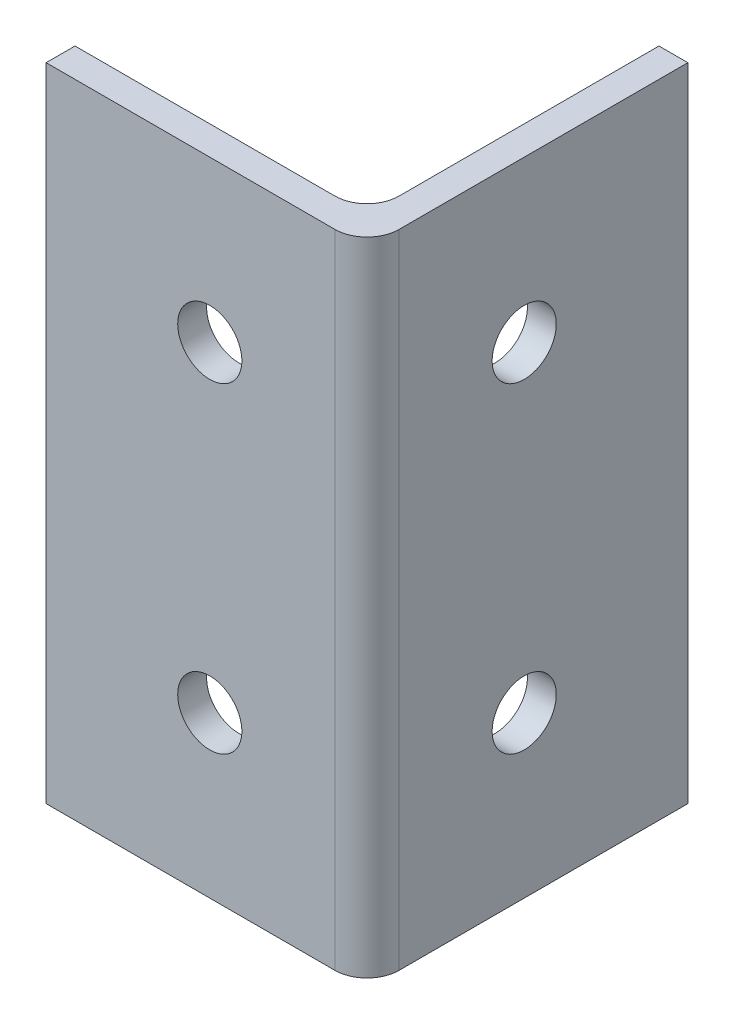
ISO-10303-21;
HEADER;
FILE_DESCRIPTION(('STEP AP214'),'2;1');
FILE_NAME('part.step','',(''),(''),'','','');
FILE_SCHEMA(('AUTOMOTIVE_DESIGN { 1 0 10303 214 1 1 1 1 }'));
ENDSEC;
DATA;
#1=APPLICATION_CONTEXT('core data for automotive mechanical design processes');
#2=APPLICATION_PROTOCOL_DEFINITION('international standard','automotive_design',2000,#1);
#3=PRODUCT_CONTEXT('',#1,'mechanical');
#4=PRODUCT('Part','Part','',(#3));
#5=PRODUCT_RELATED_PRODUCT_CATEGORY('part','',(#4));
#6=PRODUCT_DEFINITION_FORMATION('','',#4);
#7=PRODUCT_DEFINITION_CONTEXT('part definition',#1,'design');
#8=PRODUCT_DEFINITION('design','',#6,#7);
#9=PRODUCT_DEFINITION_SHAPE('','',#8);
#10=(LENGTH_UNIT() NAMED_UNIT(*) SI_UNIT(.MILLI.,.METRE.));
#11=(NAMED_UNIT(*) PLANE_ANGLE_UNIT() SI_UNIT($,.RADIAN.));
#12=(NAMED_UNIT(*) SI_UNIT($,.STERADIAN.) SOLID_ANGLE_UNIT());
#13=UNCERTAINTY_MEASURE_WITH_UNIT(LENGTH_MEASURE(1.E-05),#10,'distance_accuracy_value','');
#14=(GEOMETRIC_REPRESENTATION_CONTEXT(3) GLOBAL_UNCERTAINTY_ASSIGNED_CONTEXT((#13)) GLOBAL_UNIT_ASSIGNED_CONTEXT((#10,
#11,#12)) REPRESENTATION_CONTEXT('',''));
#15=CARTESIAN_POINT('',(0.,0.,0.));
#16=DIRECTION('',(0.,0.,1.));
#17=DIRECTION('',(1.,0.,0.));
#18=AXIS2_PLACEMENT_3D('',#15,#16,#17);
#19=CARTESIAN_POINT('',(-22.7091835511395,50.8,-14.2949948460226));
#20=DIRECTION('',(0.,0.,1.));
#21=DIRECTION('',(1.,0.,0.));
#22=AXIS2_PLACEMENT_3D('',#19,#20,#21);
#23=PLANE('',#22);
#24=DIRECTION('',(-1.,0.,0.));
#25=VECTOR('',#24,1.);
#26=CARTESIAN_POINT('',(-22.7091835511395,0.,-14.2949948460226));
#27=LINE('',#26,#25);
#28=CARTESIAN_POINT('',(-20.4231835511395,0.,-14.2949948460226));
#29=VERTEX_POINT('',#28);
#30=CARTESIAN_POINT('',(-22.7091835511395,0.,-14.2949948460226));
#31=VERTEX_POINT('',#30);
#32=EDGE_CURVE('E137',#29,#31,#27,.T.);
#33=ORIENTED_EDGE('',*,*,#32,.T.);
#34=DIRECTION('',(0.,-1.,0.));
#35=VECTOR('',#34,1.);
#36=CARTESIAN_POINT('',(-22.7091835511395,50.8,-14.2949948460226));
#37=LINE('',#36,#35);
#38=CARTESIAN_POINT('',(-22.7091835511395,50.8,-14.2949948460226));
#39=VERTEX_POINT('',#38);
#40=EDGE_CURVE('E116',#39,#31,#37,.T.);
#41=ORIENTED_EDGE('',*,*,#40,.F.);
#42=DIRECTION('',(-1.,0.,0.));
#43=VECTOR('',#42,1.);
#44=CARTESIAN_POINT('',(-22.7091835511395,50.8,-14.2949948460226));
#45=LINE('',#44,#43);
#46=CARTESIAN_POINT('',(-20.4231835511395,50.8,-14.2949948460226));
#47=VERTEX_POINT('',#46);
#48=EDGE_CURVE('E124',#47,#39,#45,.T.);
#49=ORIENTED_EDGE('',*,*,#48,.F.);
#50=DIRECTION('',(0.,-1.,0.));
#51=VECTOR('',#50,1.);
#52=CARTESIAN_POINT('',(-20.4231835511395,50.8,-14.2949948460226));
#53=LINE('',#52,#51);
#54=EDGE_CURVE('E210',#47,#29,#53,.T.);
#55=ORIENTED_EDGE('',*,*,#54,.T.);
#56=EDGE_LOOP('',(#33,#41,#49,#55));
#57=FACE_BOUND('',#56,.T.);
#58=ADVANCED_FACE('F43',(#57),#23,.F.);
#59=CARTESIAN_POINT('',(-22.7091835511395,50.8,-14.2949948460226));
#60=DIRECTION('',(1.,0.,0.));
#61=DIRECTION('',(0.,0.,-1.));
#62=AXIS2_PLACEMENT_3D('',#59,#60,#61);
#63=PLANE('',#62);
#64=CARTESIAN_POINT('',(-22.7091835511395,12.7,-1.34099484602264));
#65=DIRECTION('',(-1.,0.,0.));
#66=DIRECTION('',(0.,0.,1.));
#67=AXIS2_PLACEMENT_3D('',#64,#65,#66);
#68=CIRCLE('',#67,2.54);
#69=CARTESIAN_POINT('',(-22.7091835511395,12.7,1.19900515397736));
#70=VERTEX_POINT('',#69);
#71=EDGE_CURVE('E178',#70,#70,#68,.T.);
#72=ORIENTED_EDGE('',*,*,#71,.F.);
#73=EDGE_LOOP('',(#72));
#74=FACE_BOUND('',#73,.T.);
#75=CARTESIAN_POINT('',(-22.7091835511395,38.1,-1.34099484602272));
#76=DIRECTION('',(-1.,0.,0.));
#77=DIRECTION('',(0.,0.,1.));
#78=AXIS2_PLACEMENT_3D('',#75,#76,#77);
#79=CIRCLE('',#78,2.54);
#80=CARTESIAN_POINT('',(-22.7091835511395,38.1,1.19900515397728));
#81=VERTEX_POINT('',#80);
#82=EDGE_CURVE('E186',#81,#81,#79,.T.);
#83=ORIENTED_EDGE('',*,*,#82,.F.);
#84=EDGE_LOOP('',(#83));
#85=FACE_BOUND('',#84,.T.);
#86=DIRECTION('',(0.,0.,1.));
#87=VECTOR('',#86,1.);
#88=CARTESIAN_POINT('',(-22.7091835511395,0.,-14.2949948460226));
#89=LINE('',#88,#87);
#90=CARTESIAN_POINT('',(-22.7091835511395,0.,6.27900515397736));
#91=VERTEX_POINT('',#90);
#92=EDGE_CURVE('E213',#31,#91,#89,.T.);
#93=ORIENTED_EDGE('',*,*,#92,.T.);
#94=DIRECTION('',(0.,-1.,0.));
#95=VECTOR('',#94,1.);
#96=CARTESIAN_POINT('',(-22.7091835511395,50.8,6.27900515397736));
#97=LINE('',#96,#95);
#98=CARTESIAN_POINT('',(-22.7091835511395,50.8,6.27900515397736));
#99=VERTEX_POINT('',#98);
#100=EDGE_CURVE('E119',#91,#99,#97,.F.);
#101=ORIENTED_EDGE('',*,*,#100,.T.);
#102=DIRECTION('',(0.,0.,1.));
#103=VECTOR('',#102,1.);
#104=CARTESIAN_POINT('',(-22.7091835511395,50.8,-14.2949948460226));
#105=LINE('',#104,#103);
#106=EDGE_CURVE('E111',#39,#99,#105,.T.);
#107=ORIENTED_EDGE('',*,*,#106,.F.);
#108=ORIENTED_EDGE('',*,*,#40,.T.);
#109=EDGE_LOOP('',(#93,#101,#107,#108));
#110=FACE_BOUND('',#109,.T.);
#111=ADVANCED_FACE('F114',(#74,#85,#110),#63,.F.);
#112=CARTESIAN_POINT('',(-45.8231835511395,50.8,8.81900515397736));
#113=DIRECTION('',(0.,0.,1.));
#114=DIRECTION('',(1.,0.,0.));
#115=AXIS2_PLACEMENT_3D('',#112,#113,#114);
#116=PLANE('',#115);
#117=CARTESIAN_POINT('',(-32.8691835511395,38.1,8.81900515397736));
#118=DIRECTION('',(0.,0.,-1.));
#119=DIRECTION('',(-1.,0.,0.));
#120=AXIS2_PLACEMENT_3D('',#117,#118,#119);
#121=CIRCLE('',#120,2.54);
#122=CARTESIAN_POINT('',(-35.4091835511395,38.1,8.81900515397736));
#123=VERTEX_POINT('',#122);
#124=EDGE_CURVE('E172',#123,#123,#121,.T.);
#125=ORIENTED_EDGE('',*,*,#124,.F.);
#126=EDGE_LOOP('',(#125));
#127=FACE_BOUND('',#126,.T.);
#128=CARTESIAN_POINT('',(-32.8691835511398,12.7,8.81900515397736));
#129=DIRECTION('',(0.,0.,-1.));
#130=DIRECTION('',(-1.,0.,0.));
#131=AXIS2_PLACEMENT_3D('',#128,#129,#130);
#132=CIRCLE('',#131,2.54);
#133=CARTESIAN_POINT('',(-35.4091835511398,12.7,8.81900515397736));
#134=VERTEX_POINT('',#133);
#135=EDGE_CURVE('E184',#134,#134,#132,.T.);
#136=ORIENTED_EDGE('',*,*,#135,.F.);
#137=EDGE_LOOP('',(#136));
#138=FACE_BOUND('',#137,.T.);
#139=DIRECTION('',(-1.,0.,0.));
#140=VECTOR('',#139,1.);
#141=CARTESIAN_POINT('',(-45.8231835511395,50.8,8.81900515397736));
#142=LINE('',#141,#140);
#143=CARTESIAN_POINT('',(-25.2491835511395,50.8,8.81900515397736));
#144=VERTEX_POINT('',#143);
#145=CARTESIAN_POINT('',(-45.8231835511395,50.8,8.81900515397736));
#146=VERTEX_POINT('',#145);
#147=EDGE_CURVE('E123',#144,#146,#142,.T.);
#148=ORIENTED_EDGE('',*,*,#147,.F.);
#149=DIRECTION('',(0.,-1.,0.));
#150=VECTOR('',#149,1.);
#151=CARTESIAN_POINT('',(-25.2491835511395,0.,8.81900515397736));
#152=LINE('',#151,#150);
#153=CARTESIAN_POINT('',(-25.2491835511395,0.,8.81900515397736));
#154=VERTEX_POINT('',#153);
#155=EDGE_CURVE('E139',#144,#154,#152,.T.);
#156=ORIENTED_EDGE('',*,*,#155,.T.);
#157=DIRECTION('',(-1.,0.,0.));
#158=VECTOR('',#157,1.);
#159=CARTESIAN_POINT('',(-45.8231835511395,0.,8.81900515397736));
#160=LINE('',#159,#158);
#161=CARTESIAN_POINT('',(-45.8231835511395,0.,8.81900515397736));
#162=VERTEX_POINT('',#161);
#163=EDGE_CURVE('E216',#154,#162,#160,.T.);
#164=ORIENTED_EDGE('',*,*,#163,.T.);
#165=DIRECTION('',(0.,-1.,0.));
#166=VECTOR('',#165,1.);
#167=CARTESIAN_POINT('',(-45.8231835511395,50.8,8.81900515397736));
#168=LINE('',#167,#166);
#169=EDGE_CURVE('E140',#146,#162,#168,.T.);
#170=ORIENTED_EDGE('',*,*,#169,.F.);
#171=EDGE_LOOP('',(#148,#156,#164,#170));
#172=FACE_BOUND('',#171,.T.);
#173=ADVANCED_FACE('F241',(#127,#138,#172),#116,.F.);
#174=CARTESIAN_POINT('',(-45.8231835511395,50.8,11.1050051539774));
#175=DIRECTION('',(1.,0.,0.));
#176=DIRECTION('',(0.,0.,-1.));
#177=AXIS2_PLACEMENT_3D('',#174,#175,#176);
#178=PLANE('',#177);
#179=DIRECTION('',(0.,0.,1.));
#180=VECTOR('',#179,1.);
#181=CARTESIAN_POINT('',(-45.8231835511395,0.,11.1050051539774));
#182=LINE('',#181,#180);
#183=CARTESIAN_POINT('',(-45.8231835511395,0.,11.1050051539774));
#184=VERTEX_POINT('',#183);
#185=EDGE_CURVE('E219',#162,#184,#182,.T.);
#186=ORIENTED_EDGE('',*,*,#185,.T.);
#187=DIRECTION('',(0.,-1.,0.));
#188=VECTOR('',#187,1.);
#189=CARTESIAN_POINT('',(-45.8231835511395,50.8,11.1050051539774));
#190=LINE('',#189,#188);
#191=CARTESIAN_POINT('',(-45.8231835511395,50.8,11.1050051539774));
#192=VERTEX_POINT('',#191);
#193=EDGE_CURVE('E147',#192,#184,#190,.T.);
#194=ORIENTED_EDGE('',*,*,#193,.F.);
#195=DIRECTION('',(0.,0.,1.));
#196=VECTOR('',#195,1.);
#197=CARTESIAN_POINT('',(-45.8231835511395,50.8,11.1050051539774));
#198=LINE('',#197,#196);
#199=EDGE_CURVE('E202',#146,#192,#198,.T.);
#200=ORIENTED_EDGE('',*,*,#199,.F.);
#201=ORIENTED_EDGE('',*,*,#169,.T.);
#202=EDGE_LOOP('',(#186,#194,#200,#201));
#203=FACE_BOUND('',#202,.T.);
#204=ADVANCED_FACE('F237',(#203),#178,.F.);
#205=CARTESIAN_POINT('',(-20.4231835511395,50.8,11.1050051539774));
#206=DIRECTION('',(0.,0.,-1.));
#207=DIRECTION('',(-1.,0.,0.));
#208=AXIS2_PLACEMENT_3D('',#205,#206,#207);
#209=PLANE('',#208);
#210=CARTESIAN_POINT('',(-32.8691835511395,38.1,11.1050051539774));
#211=DIRECTION('',(0.,0.,-1.));
#212=DIRECTION('',(-1.,0.,0.));
#213=AXIS2_PLACEMENT_3D('',#210,#211,#212);
#214=CIRCLE('',#213,2.54);
#215=CARTESIAN_POINT('',(-35.4091835511395,38.1,11.1050051539774));
#216=VERTEX_POINT('',#215);
#217=EDGE_CURVE('E171',#216,#216,#214,.T.);
#218=ORIENTED_EDGE('',*,*,#217,.T.);
#219=EDGE_LOOP('',(#218));
#220=FACE_BOUND('',#219,.T.);
#221=CARTESIAN_POINT('',(-32.8691835511398,12.7,11.1050051539774));
#222=DIRECTION('',(0.,0.,-1.));
#223=DIRECTION('',(-1.,0.,0.));
#224=AXIS2_PLACEMENT_3D('',#221,#222,#223);
#225=CIRCLE('',#224,2.54);
#226=CARTESIAN_POINT('',(-35.4091835511398,12.7,11.1050051539774));
#227=VERTEX_POINT('',#226);
#228=EDGE_CURVE('E167',#227,#227,#225,.T.);
#229=ORIENTED_EDGE('',*,*,#228,.T.);
#230=EDGE_LOOP('',(#229));
#231=FACE_BOUND('',#230,.T.);
#232=DIRECTION('',(1.,0.,0.));
#233=VECTOR('',#232,1.);
#234=CARTESIAN_POINT('',(-20.4231835511395,0.,11.1050051539774));
#235=LINE('',#234,#233);
#236=CARTESIAN_POINT('',(-22.9631835511395,0.,11.1050051539774));
#237=VERTEX_POINT('',#236);
#238=EDGE_CURVE('E222',#184,#237,#235,.T.);
#239=ORIENTED_EDGE('',*,*,#238,.T.);
#240=DIRECTION('',(0.,-1.,0.));
#241=VECTOR('',#240,1.);
#242=CARTESIAN_POINT('',(-22.9631835511395,50.8,11.1050051539774));
#243=LINE('',#242,#241);
#244=CARTESIAN_POINT('',(-22.9631835511395,50.8,11.1050051539774));
#245=VERTEX_POINT('',#244);
#246=EDGE_CURVE('E53',#237,#245,#243,.F.);
#247=ORIENTED_EDGE('',*,*,#246,.T.);
#248=DIRECTION('',(1.,0.,0.));
#249=VECTOR('',#248,1.);
#250=CARTESIAN_POINT('',(-20.4231835511395,50.8,11.1050051539774));
#251=LINE('',#250,#249);
#252=EDGE_CURVE('E205',#192,#245,#251,.T.);
#253=ORIENTED_EDGE('',*,*,#252,.F.);
#254=ORIENTED_EDGE('',*,*,#193,.T.);
#255=EDGE_LOOP('',(#239,#247,#253,#254));
#256=FACE_BOUND('',#255,.T.);
#257=ADVANCED_FACE('F231',(#220,#231,#256),#209,.F.);
#258=CARTESIAN_POINT('',(-20.4231835511395,50.8,-14.2949948460226));
#259=DIRECTION('',(-1.,0.,0.));
#260=DIRECTION('',(0.,0.,1.));
#261=AXIS2_PLACEMENT_3D('',#258,#259,#260);
#262=PLANE('',#261);
#263=CARTESIAN_POINT('',(-20.4231835511395,12.7,-1.34099484602264));
#264=DIRECTION('',(-1.,0.,0.));
#265=DIRECTION('',(0.,0.,1.));
#266=AXIS2_PLACEMENT_3D('',#263,#264,#265);
#267=CIRCLE('',#266,2.54);
#268=CARTESIAN_POINT('',(-20.4231835511395,12.7,1.19900515397736));
#269=VERTEX_POINT('',#268);
#270=EDGE_CURVE('E47',#269,#269,#267,.T.);
#271=ORIENTED_EDGE('',*,*,#270,.T.);
#272=EDGE_LOOP('',(#271));
#273=FACE_BOUND('',#272,.T.);
#274=CARTESIAN_POINT('',(-20.4231835511395,38.1,-1.34099484602272));
#275=DIRECTION('',(-1.,0.,0.));
#276=DIRECTION('',(0.,0.,1.));
#277=AXIS2_PLACEMENT_3D('',#274,#275,#276);
#278=CIRCLE('',#277,2.54);
#279=CARTESIAN_POINT('',(-20.4231835511395,38.1,1.19900515397728));
#280=VERTEX_POINT('',#279);
#281=EDGE_CURVE('E175',#280,#280,#278,.T.);
#282=ORIENTED_EDGE('',*,*,#281,.T.);
#283=EDGE_LOOP('',(#282));
#284=FACE_BOUND('',#283,.T.);
#285=DIRECTION('',(0.,0.,-1.));
#286=VECTOR('',#285,1.);
#287=CARTESIAN_POINT('',(-20.4231835511395,50.8,-14.2949948460226));
#288=LINE('',#287,#286);
#289=CARTESIAN_POINT('',(-20.4231835511395,50.8,8.56500515397736));
#290=VERTEX_POINT('',#289);
#291=EDGE_CURVE('E129',#290,#47,#288,.T.);
#292=ORIENTED_EDGE('',*,*,#291,.F.);
#293=DIRECTION('',(0.,-1.,0.));
#294=VECTOR('',#293,1.);
#295=CARTESIAN_POINT('',(-20.4231835511395,50.8,8.56500515397736));
#296=LINE('',#295,#294);
#297=CARTESIAN_POINT('',(-20.4231835511395,0.,8.56500515397736));
#298=VERTEX_POINT('',#297);
#299=EDGE_CURVE('E159',#290,#298,#296,.T.);
#300=ORIENTED_EDGE('',*,*,#299,.T.);
#301=DIRECTION('',(0.,0.,-1.));
#302=VECTOR('',#301,1.);
#303=CARTESIAN_POINT('',(-20.4231835511395,0.,-14.2949948460226));
#304=LINE('',#303,#302);
#305=EDGE_CURVE('E134',#298,#29,#304,.T.);
#306=ORIENTED_EDGE('',*,*,#305,.T.);
#307=ORIENTED_EDGE('',*,*,#54,.F.);
#308=EDGE_LOOP('',(#292,#300,#306,#307));
#309=FACE_BOUND('',#308,.T.);
#310=ADVANCED_FACE('F246',(#273,#284,#309),#262,.F.);
#311=CARTESIAN_POINT('',(0.,50.8,0.));
#312=DIRECTION('',(0.,-1.,0.));
#313=DIRECTION('',(0.,0.,-1.));
#314=AXIS2_PLACEMENT_3D('',#311,#312,#313);
#315=PLANE('',#314);
#316=ORIENTED_EDGE('',*,*,#252,.T.);
#317=CARTESIAN_POINT('',(-22.9631835511395,50.8,8.56500515397736));
#318=DIRECTION('',(0.,-1.,0.));
#319=DIRECTION('',(0.,0.,-1.));
#320=AXIS2_PLACEMENT_3D('',#317,#318,#319);
#321=CIRCLE('',#320,2.54);
#322=EDGE_CURVE('E11',#245,#290,#321,.F.);
#323=ORIENTED_EDGE('',*,*,#322,.T.);
#324=ORIENTED_EDGE('',*,*,#291,.T.);
#325=ORIENTED_EDGE('',*,*,#48,.T.);
#326=ORIENTED_EDGE('',*,*,#106,.T.);
#327=CARTESIAN_POINT('',(-25.2491835511395,50.8,6.27900515397736));
#328=DIRECTION('',(0.,-1.,0.));
#329=DIRECTION('',(0.,0.,-1.));
#330=AXIS2_PLACEMENT_3D('',#327,#328,#329);
#331=CIRCLE('',#330,2.54);
#332=EDGE_CURVE('E156',#99,#144,#331,.T.);
#333=ORIENTED_EDGE('',*,*,#332,.T.);
#334=ORIENTED_EDGE('',*,*,#147,.T.);
#335=ORIENTED_EDGE('',*,*,#199,.T.);
#336=EDGE_LOOP('',(#316,#323,#324,#325,#326,#333,#334,#335));
#337=FACE_BOUND('',#336,.T.);
#338=ADVANCED_FACE('F127',(#337),#315,.F.);
#339=CARTESIAN_POINT('',(0.,0.,0.));
#340=DIRECTION('',(0.,-1.,0.));
#341=DIRECTION('',(0.,0.,-1.));
#342=AXIS2_PLACEMENT_3D('',#339,#340,#341);
#343=PLANE('',#342);
#344=ORIENTED_EDGE('',*,*,#305,.F.);
#345=CARTESIAN_POINT('',(-22.9631835511395,0.,8.56500515397736));
#346=DIRECTION('',(0.,-1.,0.));
#347=DIRECTION('',(0.,0.,-1.));
#348=AXIS2_PLACEMENT_3D('',#345,#346,#347);
#349=CIRCLE('',#348,2.54);
#350=EDGE_CURVE('E68',#298,#237,#349,.T.);
#351=ORIENTED_EDGE('',*,*,#350,.T.);
#352=ORIENTED_EDGE('',*,*,#238,.F.);
#353=ORIENTED_EDGE('',*,*,#185,.F.);
#354=ORIENTED_EDGE('',*,*,#163,.F.);
#355=CARTESIAN_POINT('',(-25.2491835511395,0.,6.27900515397736));
#356=DIRECTION('',(0.,-1.,0.));
#357=DIRECTION('',(0.,0.,-1.));
#358=AXIS2_PLACEMENT_3D('',#355,#356,#357);
#359=CIRCLE('',#358,2.54);
#360=EDGE_CURVE('E153',#154,#91,#359,.F.);
#361=ORIENTED_EDGE('',*,*,#360,.T.);
#362=ORIENTED_EDGE('',*,*,#92,.F.);
#363=ORIENTED_EDGE('',*,*,#32,.F.);
#364=EDGE_LOOP('',(#344,#351,#352,#353,#354,#361,#362,#363));
#365=FACE_BOUND('',#364,.T.);
#366=ADVANCED_FACE('F235',(#365),#343,.T.);
#367=CARTESIAN_POINT('',(-25.2491835511395,50.8,6.27900515397736));
#368=DIRECTION('',(0.,1.,0.));
#369=DIRECTION('',(0.,0.,1.));
#370=AXIS2_PLACEMENT_3D('',#367,#368,#369);
#371=CYLINDRICAL_SURFACE('',#370,2.54);
#372=ORIENTED_EDGE('',*,*,#332,.F.);
#373=ORIENTED_EDGE('',*,*,#100,.F.);
#374=ORIENTED_EDGE('',*,*,#360,.F.);
#375=ORIENTED_EDGE('',*,*,#155,.F.);
#376=EDGE_LOOP('',(#372,#373,#374,#375));
#377=FACE_BOUND('',#376,.T.);
#378=ADVANCED_FACE('F244',(#377),#371,.F.);
#379=CARTESIAN_POINT('',(-22.9631835511395,50.8,8.56500515397736));
#380=DIRECTION('',(0.,-1.,0.));
#381=DIRECTION('',(0.,0.,-1.));
#382=AXIS2_PLACEMENT_3D('',#379,#380,#381);
#383=CYLINDRICAL_SURFACE('',#382,2.54);
#384=ORIENTED_EDGE('',*,*,#322,.F.);
#385=ORIENTED_EDGE('',*,*,#246,.F.);
#386=ORIENTED_EDGE('',*,*,#350,.F.);
#387=ORIENTED_EDGE('',*,*,#299,.F.);
#388=EDGE_LOOP('',(#384,#385,#386,#387));
#389=FACE_BOUND('',#388,.T.);
#390=ADVANCED_FACE('F45',(#389),#383,.T.);
#391=CARTESIAN_POINT('',(-32.8691835511398,12.7,59.6190051539774));
#392=DIRECTION('',(0.,0.,-1.));
#393=DIRECTION('',(-1.,0.,0.));
#394=AXIS2_PLACEMENT_3D('',#391,#392,#393);
#395=CYLINDRICAL_SURFACE('',#394,2.54);
#396=ORIENTED_EDGE('',*,*,#135,.T.);
#397=EDGE_LOOP('',(#396));
#398=FACE_BOUND('',#397,.T.);
#399=ORIENTED_EDGE('',*,*,#228,.F.);
#400=EDGE_LOOP('',(#399));
#401=FACE_BOUND('',#400,.T.);
#402=ADVANCED_FACE('F251',(#398,#401),#395,.F.);
#403=CARTESIAN_POINT('',(-32.8691835511395,38.1,59.6190051539774));
#404=DIRECTION('',(0.,0.,-1.));
#405=DIRECTION('',(-1.,0.,0.));
#406=AXIS2_PLACEMENT_3D('',#403,#404,#405);
#407=CYLINDRICAL_SURFACE('',#406,2.54);
#408=ORIENTED_EDGE('',*,*,#124,.T.);
#409=EDGE_LOOP('',(#408));
#410=FACE_BOUND('',#409,.T.);
#411=ORIENTED_EDGE('',*,*,#217,.F.);
#412=EDGE_LOOP('',(#411));
#413=FACE_BOUND('',#412,.T.);
#414=ADVANCED_FACE('F256',(#410,#413),#407,.F.);
#415=CARTESIAN_POINT('',(28.0908164488605,38.1,-1.34099484602272));
#416=DIRECTION('',(-1.,0.,0.));
#417=DIRECTION('',(0.,0.,1.));
#418=AXIS2_PLACEMENT_3D('',#415,#416,#417);
#419=CYLINDRICAL_SURFACE('',#418,2.54);
#420=ORIENTED_EDGE('',*,*,#82,.T.);
#421=EDGE_LOOP('',(#420));
#422=FACE_BOUND('',#421,.T.);
#423=ORIENTED_EDGE('',*,*,#281,.F.);
#424=EDGE_LOOP('',(#423));
#425=FACE_BOUND('',#424,.T.);
#426=ADVANCED_FACE('F284',(#422,#425),#419,.F.);
#427=CARTESIAN_POINT('',(28.0908164488605,12.7,-1.34099484602264));
#428=DIRECTION('',(-1.,0.,0.));
#429=DIRECTION('',(0.,0.,1.));
#430=AXIS2_PLACEMENT_3D('',#427,#428,#429);
#431=CYLINDRICAL_SURFACE('',#430,2.54);
#432=ORIENTED_EDGE('',*,*,#71,.T.);
#433=EDGE_LOOP('',(#432));
#434=FACE_BOUND('',#433,.T.);
#435=ORIENTED_EDGE('',*,*,#270,.F.);
#436=EDGE_LOOP('',(#435));
#437=FACE_BOUND('',#436,.T.);
#438=ADVANCED_FACE('F288',(#434,#437),#431,.F.);
#439=CLOSED_SHELL('',(#58,#111,#173,#204,#257,#310,#338,#366,#378,#390,#402,#414,#426,#438));
#440=MANIFOLD_SOLID_BREP('B2',#439);
#441=ADVANCED_BREP_SHAPE_REPRESENTATION('',(#18,#440),#14);
#442=SHAPE_DEFINITION_REPRESENTATION(#9,#441);
ENDSEC;
END-ISO-10303-21;
